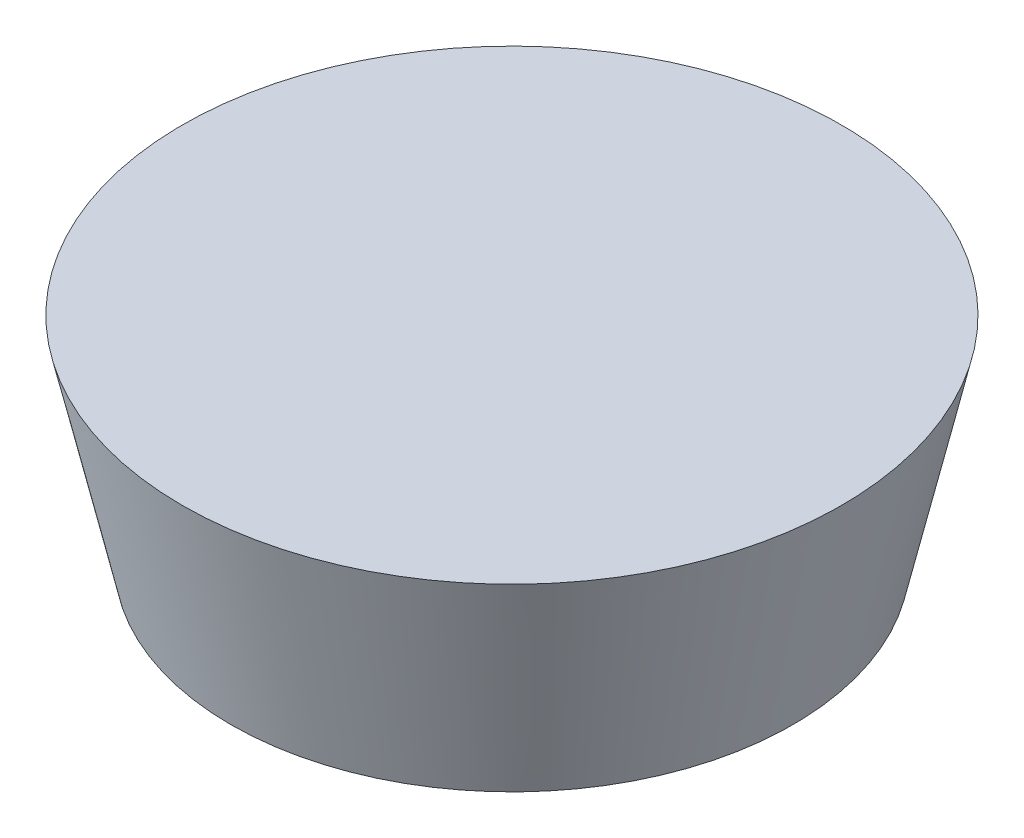
ISO-10303-21;
HEADER;
FILE_DESCRIPTION(('STEP AP214'),'2;1');
FILE_NAME('part.step','',(''),(''),'','','');
FILE_SCHEMA(('AUTOMOTIVE_DESIGN { 1 0 10303 214 1 1 1 1 }'));
ENDSEC;
DATA;
#1=APPLICATION_CONTEXT('core data for automotive mechanical design processes');
#2=APPLICATION_PROTOCOL_DEFINITION('international standard','automotive_design',2000,#1);
#3=PRODUCT_CONTEXT('',#1,'mechanical');
#4=PRODUCT('Part','Part','',(#3));
#5=PRODUCT_RELATED_PRODUCT_CATEGORY('part','',(#4));
#6=PRODUCT_DEFINITION_FORMATION('','',#4);
#7=PRODUCT_DEFINITION_CONTEXT('part definition',#1,'design');
#8=PRODUCT_DEFINITION('design','',#6,#7);
#9=PRODUCT_DEFINITION_SHAPE('','',#8);
#10=(LENGTH_UNIT() NAMED_UNIT(*) SI_UNIT(.MILLI.,.METRE.));
#11=(NAMED_UNIT(*) PLANE_ANGLE_UNIT() SI_UNIT($,.RADIAN.));
#12=(NAMED_UNIT(*) SI_UNIT($,.STERADIAN.) SOLID_ANGLE_UNIT());
#13=UNCERTAINTY_MEASURE_WITH_UNIT(LENGTH_MEASURE(1.E-05),#10,'distance_accuracy_value','');
#14=(GEOMETRIC_REPRESENTATION_CONTEXT(3) GLOBAL_UNCERTAINTY_ASSIGNED_CONTEXT((#13)) GLOBAL_UNIT_ASSIGNED_CONTEXT((#10,
#11,#12)) REPRESENTATION_CONTEXT('',''));
#15=CARTESIAN_POINT('',(0.,0.,0.));
#16=DIRECTION('',(0.,0.,1.));
#17=DIRECTION('',(1.,0.,0.));
#18=AXIS2_PLACEMENT_3D('',#15,#16,#17);
#19=CARTESIAN_POINT('',(0.,25.4,0.));
#20=DIRECTION('',(0.,1.,0.));
#21=DIRECTION('',(0.,0.,1.));
#22=AXIS2_PLACEMENT_3D('',#19,#20,#21);
#23=CONICAL_SURFACE('',#22,22.4234375,0.222801153759395);
#24=CARTESIAN_POINT('',(0.,0.,0.));
#25=DIRECTION('',(0.,-1.,0.));
#26=DIRECTION('',(0.,0.,-1.));
#27=AXIS2_PLACEMENT_3D('',#24,#25,#26);
#28=CIRCLE('',#27,16.66875);
#29=CARTESIAN_POINT('',(0.,0.,-16.66875));
#30=VERTEX_POINT('',#29);
#31=EDGE_CURVE('E10',#30,#30,#28,.T.);
#32=ORIENTED_EDGE('',*,*,#31,.F.);
#33=EDGE_LOOP('',(#32));
#34=FACE_BOUND('',#33,.T.);
#35=CARTESIAN_POINT('',(0.,12.7,0.));
#36=DIRECTION('',(0.,1.,0.));
#37=DIRECTION('',(0.,0.,1.));
#38=AXIS2_PLACEMENT_3D('',#35,#36,#37);
#39=CIRCLE('',#38,19.54609375);
#40=CARTESIAN_POINT('',(0.,12.7,19.54609375));
#41=VERTEX_POINT('',#40);
#42=EDGE_CURVE('E35',#41,#41,#39,.T.);
#43=ORIENTED_EDGE('',*,*,#42,.F.);
#44=EDGE_LOOP('',(#43));
#45=FACE_BOUND('',#44,.T.);
#46=ADVANCED_FACE('F31',(#34,#45),#23,.T.);
#47=CARTESIAN_POINT('',(-16.66875,0.,0.));
#48=DIRECTION('',(0.,1.,0.));
#49=DIRECTION('',(0.,0.,1.));
#50=AXIS2_PLACEMENT_3D('',#47,#48,#49);
#51=PLANE('',#50);
#52=ORIENTED_EDGE('',*,*,#31,.T.);
#53=EDGE_LOOP('',(#52));
#54=FACE_BOUND('',#53,.T.);
#55=ADVANCED_FACE('F33',(#54),#51,.F.);
#56=CARTESIAN_POINT('',(0.,12.7,0.));
#57=DIRECTION('',(0.,1.,0.));
#58=DIRECTION('',(0.,0.,1.));
#59=AXIS2_PLACEMENT_3D('',#56,#57,#58);
#60=PLANE('',#59);
#61=ORIENTED_EDGE('',*,*,#42,.T.);
#62=EDGE_LOOP('',(#61));
#63=FACE_BOUND('',#62,.T.);
#64=ADVANCED_FACE('F44',(#63),#60,.T.);
#65=CLOSED_SHELL('',(#46,#55,#64));
#66=MANIFOLD_SOLID_BREP('B2',#65);
#67=ADVANCED_BREP_SHAPE_REPRESENTATION('',(#18,#66),#14);
#68=SHAPE_DEFINITION_REPRESENTATION(#9,#67);
ENDSEC;
END-ISO-10303-21;
